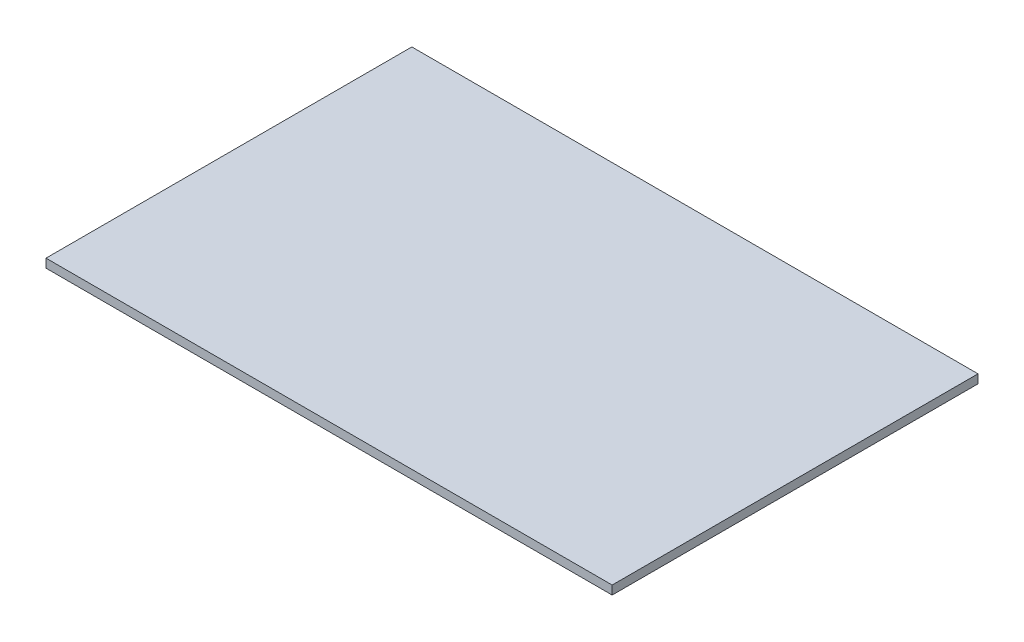
ISO-10303-21;
HEADER;
FILE_DESCRIPTION(('STEP AP214'),'2;1');
FILE_NAME('part.step','',(''),(''),'','','');
FILE_SCHEMA(('AUTOMOTIVE_DESIGN { 1 0 10303 214 1 1 1 1 }'));
ENDSEC;
DATA;
#1=APPLICATION_CONTEXT('core data for automotive mechanical design processes');
#2=APPLICATION_PROTOCOL_DEFINITION('international standard','automotive_design',2000,#1);
#3=PRODUCT_CONTEXT('',#1,'mechanical');
#4=PRODUCT('Part','Part','',(#3));
#5=PRODUCT_RELATED_PRODUCT_CATEGORY('part','',(#4));
#6=PRODUCT_DEFINITION_FORMATION('','',#4);
#7=PRODUCT_DEFINITION_CONTEXT('part definition',#1,'design');
#8=PRODUCT_DEFINITION('design','',#6,#7);
#9=PRODUCT_DEFINITION_SHAPE('','',#8);
#10=(LENGTH_UNIT() NAMED_UNIT(*) SI_UNIT(.MILLI.,.METRE.));
#11=(NAMED_UNIT(*) PLANE_ANGLE_UNIT() SI_UNIT($,.RADIAN.));
#12=(NAMED_UNIT(*) SI_UNIT($,.STERADIAN.) SOLID_ANGLE_UNIT());
#13=UNCERTAINTY_MEASURE_WITH_UNIT(LENGTH_MEASURE(1.E-05),#10,'distance_accuracy_value','');
#14=(GEOMETRIC_REPRESENTATION_CONTEXT(3) GLOBAL_UNCERTAINTY_ASSIGNED_CONTEXT((#13)) GLOBAL_UNIT_ASSIGNED_CONTEXT((#10,
#11,#12)) REPRESENTATION_CONTEXT('',''));
#15=CARTESIAN_POINT('',(0.,0.,0.));
#16=DIRECTION('',(0.,0.,1.));
#17=DIRECTION('',(1.,0.,0.));
#18=AXIS2_PLACEMENT_3D('',#15,#16,#17);
#19=CARTESIAN_POINT('',(-97.5,2.99999999999999,-126.));
#20=DIRECTION('',(-1.,0.,0.));
#21=DIRECTION('',(0.,0.,1.));
#22=AXIS2_PLACEMENT_3D('',#19,#20,#21);
#23=PLANE('',#22);
#24=DIRECTION('',(0.,-1.,0.));
#25=VECTOR('',#24,1.);
#26=CARTESIAN_POINT('',(-97.5,2.99999999999999,0.));
#27=LINE('',#26,#25);
#28=CARTESIAN_POINT('',(-97.5,2.99999999999999,0.));
#29=VERTEX_POINT('',#28);
#30=CARTESIAN_POINT('',(-97.5,0.,0.));
#31=VERTEX_POINT('',#30);
#32=EDGE_CURVE('E117',#29,#31,#27,.T.);
#33=ORIENTED_EDGE('',*,*,#32,.F.);
#34=DIRECTION('',(0.,0.,1.));
#35=VECTOR('',#34,1.);
#36=CARTESIAN_POINT('',(-97.5,2.99999999999999,-126.));
#37=LINE('',#36,#35);
#38=CARTESIAN_POINT('',(-97.5,2.99999999999999,-126.));
#39=VERTEX_POINT('',#38);
#40=EDGE_CURVE('E11',#39,#29,#37,.T.);
#41=ORIENTED_EDGE('',*,*,#40,.F.);
#42=DIRECTION('',(0.,-1.,0.));
#43=VECTOR('',#42,1.);
#44=CARTESIAN_POINT('',(-97.5,2.99999999999999,-126.));
#45=LINE('',#44,#43);
#46=CARTESIAN_POINT('',(-97.5,0.,-126.));
#47=VERTEX_POINT('',#46);
#48=EDGE_CURVE('E109',#39,#47,#45,.T.);
#49=ORIENTED_EDGE('',*,*,#48,.T.);
#50=DIRECTION('',(0.,0.,1.));
#51=VECTOR('',#50,1.);
#52=CARTESIAN_POINT('',(-97.5,0.,-126.));
#53=LINE('',#52,#51);
#54=EDGE_CURVE('E50',#47,#31,#53,.T.);
#55=ORIENTED_EDGE('',*,*,#54,.T.);
#56=EDGE_LOOP('',(#33,#41,#49,#55));
#57=FACE_BOUND('',#56,.T.);
#58=ADVANCED_FACE('F47',(#57),#23,.T.);
#59=CARTESIAN_POINT('',(-97.5,2.99999999999999,-126.));
#60=DIRECTION('',(0.,1.,0.));
#61=DIRECTION('',(-1.,0.,0.));
#62=AXIS2_PLACEMENT_3D('',#59,#60,#61);
#63=PLANE('',#62);
#64=DIRECTION('',(-1.,0.,0.));
#65=VECTOR('',#64,1.);
#66=CARTESIAN_POINT('',(-97.5,2.99999999999999,0.));
#67=LINE('',#66,#65);
#68=CARTESIAN_POINT('',(97.5,3.00000000000002,0.));
#69=VERTEX_POINT('',#68);
#70=EDGE_CURVE('E112',#69,#29,#67,.T.);
#71=ORIENTED_EDGE('',*,*,#70,.F.);
#72=DIRECTION('',(0.,0.,1.));
#73=VECTOR('',#72,1.);
#74=CARTESIAN_POINT('',(97.5,3.00000000000002,-126.));
#75=LINE('',#74,#73);
#76=CARTESIAN_POINT('',(97.5,3.00000000000002,-126.));
#77=VERTEX_POINT('',#76);
#78=EDGE_CURVE('E57',#77,#69,#75,.T.);
#79=ORIENTED_EDGE('',*,*,#78,.F.);
#80=DIRECTION('',(-1.,0.,0.));
#81=VECTOR('',#80,1.);
#82=CARTESIAN_POINT('',(-97.5,2.99999999999999,-126.));
#83=LINE('',#82,#81);
#84=EDGE_CURVE('E104',#77,#39,#83,.T.);
#85=ORIENTED_EDGE('',*,*,#84,.T.);
#86=ORIENTED_EDGE('',*,*,#40,.T.);
#87=EDGE_LOOP('',(#71,#79,#85,#86));
#88=FACE_BOUND('',#87,.T.);
#89=ADVANCED_FACE('F133',(#88),#63,.T.);
#90=CARTESIAN_POINT('',(97.5,3.00000000000002,-126.));
#91=DIRECTION('',(1.,0.,0.));
#92=DIRECTION('',(0.,0.,-1.));
#93=AXIS2_PLACEMENT_3D('',#90,#91,#92);
#94=PLANE('',#93);
#95=DIRECTION('',(0.,1.,0.));
#96=VECTOR('',#95,1.);
#97=CARTESIAN_POINT('',(97.5,3.00000000000002,0.));
#98=LINE('',#97,#96);
#99=CARTESIAN_POINT('',(97.5,0.,0.));
#100=VERTEX_POINT('',#99);
#101=EDGE_CURVE('E98',#100,#69,#98,.T.);
#102=ORIENTED_EDGE('',*,*,#101,.F.);
#103=DIRECTION('',(0.,0.,1.));
#104=VECTOR('',#103,1.);
#105=CARTESIAN_POINT('',(97.5,0.,-126.));
#106=LINE('',#105,#104);
#107=CARTESIAN_POINT('',(97.5,0.,-126.));
#108=VERTEX_POINT('',#107);
#109=EDGE_CURVE('E93',#108,#100,#106,.T.);
#110=ORIENTED_EDGE('',*,*,#109,.F.);
#111=DIRECTION('',(0.,1.,0.));
#112=VECTOR('',#111,1.);
#113=CARTESIAN_POINT('',(97.5,3.00000000000002,-126.));
#114=LINE('',#113,#112);
#115=EDGE_CURVE('E96',#108,#77,#114,.T.);
#116=ORIENTED_EDGE('',*,*,#115,.T.);
#117=ORIENTED_EDGE('',*,*,#78,.T.);
#118=EDGE_LOOP('',(#102,#110,#116,#117));
#119=FACE_BOUND('',#118,.T.);
#120=ADVANCED_FACE('F95',(#119),#94,.T.);
#121=CARTESIAN_POINT('',(-97.5,0.,-126.));
#122=DIRECTION('',(0.,-1.,0.));
#123=DIRECTION('',(0.,0.,-1.));
#124=AXIS2_PLACEMENT_3D('',#121,#122,#123);
#125=PLANE('',#124);
#126=DIRECTION('',(1.,0.,0.));
#127=VECTOR('',#126,1.);
#128=CARTESIAN_POINT('',(-97.5,0.,0.));
#129=LINE('',#128,#127);
#130=EDGE_CURVE('E121',#31,#100,#129,.T.);
#131=ORIENTED_EDGE('',*,*,#130,.F.);
#132=ORIENTED_EDGE('',*,*,#54,.F.);
#133=DIRECTION('',(1.,0.,0.));
#134=VECTOR('',#133,1.);
#135=CARTESIAN_POINT('',(-97.5,0.,-126.));
#136=LINE('',#135,#134);
#137=EDGE_CURVE('E103',#47,#108,#136,.T.);
#138=ORIENTED_EDGE('',*,*,#137,.T.);
#139=ORIENTED_EDGE('',*,*,#109,.T.);
#140=EDGE_LOOP('',(#131,#132,#138,#139));
#141=FACE_BOUND('',#140,.T.);
#142=ADVANCED_FACE('F107',(#141),#125,.T.);
#143=CARTESIAN_POINT('',(0.,0.,-126.));
#144=DIRECTION('',(0.,0.,1.));
#145=DIRECTION('',(1.,0.,0.));
#146=AXIS2_PLACEMENT_3D('',#143,#144,#145);
#147=PLANE('',#146);
#148=ORIENTED_EDGE('',*,*,#48,.F.);
#149=ORIENTED_EDGE('',*,*,#84,.F.);
#150=ORIENTED_EDGE('',*,*,#115,.F.);
#151=ORIENTED_EDGE('',*,*,#137,.F.);
#152=EDGE_LOOP('',(#148,#149,#150,#151));
#153=FACE_BOUND('',#152,.T.);
#154=ADVANCED_FACE('F102',(#153),#147,.F.);
#155=CARTESIAN_POINT('',(0.,0.,0.));
#156=DIRECTION('',(0.,0.,1.));
#157=DIRECTION('',(1.,0.,0.));
#158=AXIS2_PLACEMENT_3D('',#155,#156,#157);
#159=PLANE('',#158);
#160=ORIENTED_EDGE('',*,*,#32,.T.);
#161=ORIENTED_EDGE('',*,*,#130,.T.);
#162=ORIENTED_EDGE('',*,*,#101,.T.);
#163=ORIENTED_EDGE('',*,*,#70,.T.);
#164=EDGE_LOOP('',(#160,#161,#162,#163));
#165=FACE_BOUND('',#164,.T.);
#166=ADVANCED_FACE('F132',(#165),#159,.T.);
#167=CLOSED_SHELL('',(#58,#89,#120,#142,#154,#166));
#168=MANIFOLD_SOLID_BREP('B2',#167);
#169=ADVANCED_BREP_SHAPE_REPRESENTATION('',(#18,#168),#14);
#170=SHAPE_DEFINITION_REPRESENTATION(#9,#169);
ENDSEC;
END-ISO-10303-21;
